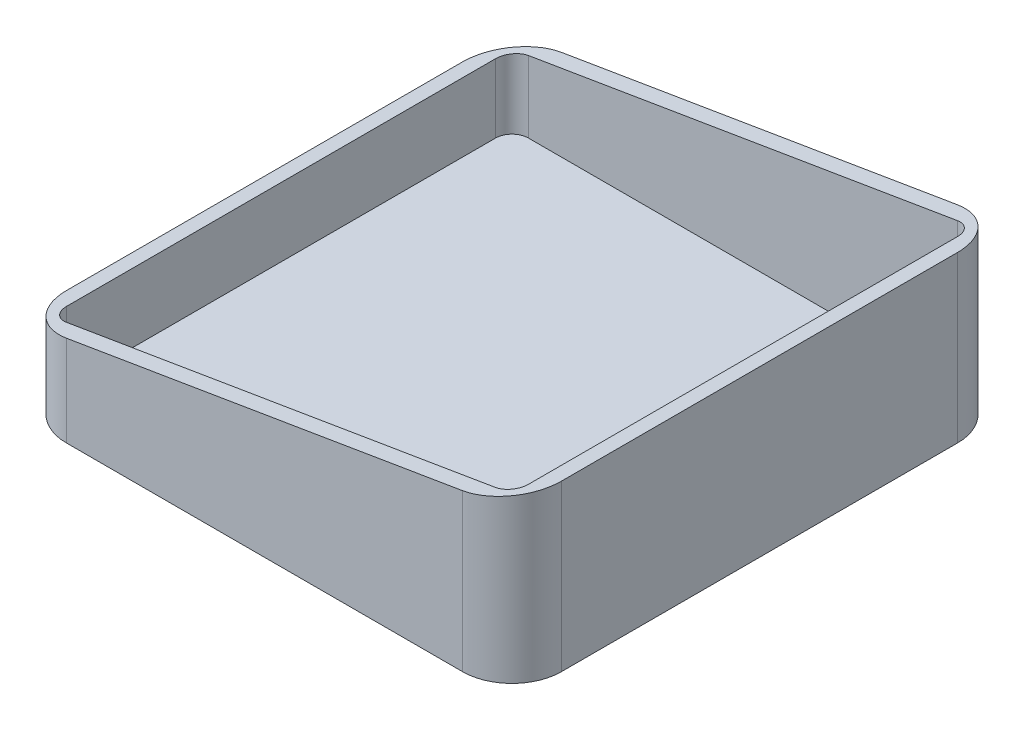
ISO-10303-21;
HEADER;
FILE_DESCRIPTION(('STEP AP214'),'2;1');
FILE_NAME('part.step','',(''),(''),'','','');
FILE_SCHEMA(('AUTOMOTIVE_DESIGN { 1 0 10303 214 1 1 1 1 }'));
ENDSEC;
DATA;
#1=APPLICATION_CONTEXT('core data for automotive mechanical design processes');
#2=APPLICATION_PROTOCOL_DEFINITION('international standard','automotive_design',2000,#1);
#3=PRODUCT_CONTEXT('',#1,'mechanical');
#4=PRODUCT('Part','Part','',(#3));
#5=PRODUCT_RELATED_PRODUCT_CATEGORY('part','',(#4));
#6=PRODUCT_DEFINITION_FORMATION('','',#4);
#7=PRODUCT_DEFINITION_CONTEXT('part definition',#1,'design');
#8=PRODUCT_DEFINITION('design','',#6,#7);
#9=PRODUCT_DEFINITION_SHAPE('','',#8);
#10=(LENGTH_UNIT() NAMED_UNIT(*) SI_UNIT(.MILLI.,.METRE.));
#11=(NAMED_UNIT(*) PLANE_ANGLE_UNIT() SI_UNIT($,.RADIAN.));
#12=(NAMED_UNIT(*) SI_UNIT($,.STERADIAN.) SOLID_ANGLE_UNIT());
#13=UNCERTAINTY_MEASURE_WITH_UNIT(LENGTH_MEASURE(1.E-05),#10,'distance_accuracy_value','');
#14=(GEOMETRIC_REPRESENTATION_CONTEXT(3) GLOBAL_UNCERTAINTY_ASSIGNED_CONTEXT((#13)) GLOBAL_UNIT_ASSIGNED_CONTEXT((#10,
#11,#12)) REPRESENTATION_CONTEXT('',''));
#15=CARTESIAN_POINT('',(0.,0.,0.));
#16=DIRECTION('',(0.,0.,1.));
#17=DIRECTION('',(1.,0.,0.));
#18=AXIS2_PLACEMENT_3D('',#15,#16,#17);
#19=CARTESIAN_POINT('',(150.,83.3783783783784,300.));
#20=DIRECTION('',(0.164398987305357,-0.986393923832144,0.));
#21=DIRECTION('',(0.986393923832144,0.164398987305357,0.));
#22=AXIS2_PLACEMENT_3D('',#19,#20,#21);
#23=PLANE('',#22);
#24=DIRECTION('',(-0.986393923832144,-0.164398987305357,0.));
#25=VECTOR('',#24,1.);
#26=CARTESIAN_POINT('',(150.,83.3783783783784,0.));
#27=LINE('',#26,#25);
#28=CARTESIAN_POINT('',(120.,78.3783783783784,0.));
#29=VERTEX_POINT('',#28);
#30=CARTESIAN_POINT('',(-120.,38.3783783783784,0.));
#31=VERTEX_POINT('',#30);
#32=EDGE_CURVE('E278',#29,#31,#27,.T.);
#33=ORIENTED_EDGE('',*,*,#32,.T.);
#34=CARTESIAN_POINT('',(-120.,38.3783783783784,30.));
#35=DIRECTION('',(0.164398987305357,-0.986393923832144,0.));
#36=DIRECTION('',(-0.986393923832144,-0.164398987305357,0.));
#37=AXIS2_PLACEMENT_3D('',#34,#35,#36);
#38=ELLIPSE('',#37,30.4138126514911,30.);
#39=CARTESIAN_POINT('',(-150.,33.3783783783784,30.));
#40=VERTEX_POINT('',#39);
#41=EDGE_CURVE('E194',#31,#40,#38,.F.);
#42=ORIENTED_EDGE('',*,*,#41,.T.);
#43=DIRECTION('',(0.,0.,-1.));
#44=VECTOR('',#43,1.);
#45=CARTESIAN_POINT('',(-150.,33.3783783783784,300.));
#46=LINE('',#45,#44);
#47=CARTESIAN_POINT('',(-150.,33.3783783783784,270.));
#48=VERTEX_POINT('',#47);
#49=EDGE_CURVE('E281',#48,#40,#46,.T.);
#50=ORIENTED_EDGE('',*,*,#49,.F.);
#51=CARTESIAN_POINT('',(-120.,38.3783783783784,270.));
#52=DIRECTION('',(0.164398987305357,-0.986393923832144,0.));
#53=DIRECTION('',(0.986393923832144,0.164398987305357,0.));
#54=AXIS2_PLACEMENT_3D('',#51,#52,#53);
#55=ELLIPSE('',#54,30.4138126514911,30.);
#56=CARTESIAN_POINT('',(-120.,38.3783783783784,300.));
#57=VERTEX_POINT('',#56);
#58=EDGE_CURVE('E175',#48,#57,#55,.F.);
#59=ORIENTED_EDGE('',*,*,#58,.T.);
#60=DIRECTION('',(-0.986393923832144,-0.164398987305357,0.));
#61=VECTOR('',#60,1.);
#62=CARTESIAN_POINT('',(150.,83.3783783783784,300.));
#63=LINE('',#62,#61);
#64=CARTESIAN_POINT('',(120.,78.3783783783784,300.));
#65=VERTEX_POINT('',#64);
#66=EDGE_CURVE('E277',#65,#57,#63,.T.);
#67=ORIENTED_EDGE('',*,*,#66,.F.);
#68=CARTESIAN_POINT('',(120.,78.3783783783784,270.));
#69=DIRECTION('',(0.164398987305357,-0.986393923832144,0.));
#70=DIRECTION('',(-0.986393923832144,-0.164398987305357,0.));
#71=AXIS2_PLACEMENT_3D('',#68,#69,#70);
#72=ELLIPSE('',#71,30.4138126514911,30.);
#73=CARTESIAN_POINT('',(150.,83.3783783783784,270.));
#74=VERTEX_POINT('',#73);
#75=EDGE_CURVE('E190',#65,#74,#72,.F.);
#76=ORIENTED_EDGE('',*,*,#75,.T.);
#77=DIRECTION('',(0.,0.,-1.));
#78=VECTOR('',#77,1.);
#79=CARTESIAN_POINT('',(150.,83.3783783783784,300.));
#80=LINE('',#79,#78);
#81=CARTESIAN_POINT('',(150.,83.3783783783784,30.));
#82=VERTEX_POINT('',#81);
#83=EDGE_CURVE('E287',#74,#82,#80,.T.);
#84=ORIENTED_EDGE('',*,*,#83,.T.);
#85=CARTESIAN_POINT('',(120.,78.3783783783784,30.));
#86=DIRECTION('',(0.164398987305357,-0.986393923832144,0.));
#87=DIRECTION('',(0.986393923832144,0.164398987305357,0.));
#88=AXIS2_PLACEMENT_3D('',#85,#86,#87);
#89=ELLIPSE('',#88,30.4138126514911,30.);
#90=EDGE_CURVE('E192',#82,#29,#89,.F.);
#91=ORIENTED_EDGE('',*,*,#90,.T.);
#92=EDGE_LOOP('',(#33,#42,#50,#59,#67,#76,#84,#91));
#93=FACE_BOUND('',#92,.T.);
#94=DIRECTION('',(-0.986393923832144,-0.164398987305357,0.));
#95=VECTOR('',#94,1.);
#96=CARTESIAN_POINT('',(150.,83.3783783783784,10.));
#97=LINE('',#96,#95);
#98=CARTESIAN_POINT('',(130.,80.045045045045,10.));
#99=VERTEX_POINT('',#98);
#100=CARTESIAN_POINT('',(-130.,36.7117117117117,10.));
#101=VERTEX_POINT('',#100);
#102=EDGE_CURVE('E271',#99,#101,#97,.T.);
#103=ORIENTED_EDGE('',*,*,#102,.F.);
#104=CARTESIAN_POINT('',(130.,80.045045045045,20.));
#105=DIRECTION('',(0.164398987305357,-0.986393923832144,0.));
#106=DIRECTION('',(-0.986393923832144,-0.164398987305357,0.));
#107=AXIS2_PLACEMENT_3D('',#104,#105,#106);
#108=ELLIPSE('',#107,10.137937550497,10.);
#109=CARTESIAN_POINT('',(140.,81.7117117117117,20.));
#110=VERTEX_POINT('',#109);
#111=EDGE_CURVE('E11',#99,#110,#108,.T.);
#112=ORIENTED_EDGE('',*,*,#111,.T.);
#113=DIRECTION('',(0.,0.,-1.));
#114=VECTOR('',#113,1.);
#115=CARTESIAN_POINT('',(140.,81.7117117117117,300.));
#116=LINE('',#115,#114);
#117=CARTESIAN_POINT('',(140.,81.7117117117117,280.));
#118=VERTEX_POINT('',#117);
#119=EDGE_CURVE('E240',#118,#110,#116,.T.);
#120=ORIENTED_EDGE('',*,*,#119,.F.);
#121=CARTESIAN_POINT('',(130.,80.045045045045,280.));
#122=DIRECTION('',(0.164398987305357,-0.986393923832144,0.));
#123=DIRECTION('',(0.986393923832144,0.164398987305357,0.));
#124=AXIS2_PLACEMENT_3D('',#121,#122,#123);
#125=ELLIPSE('',#124,10.137937550497,10.);
#126=CARTESIAN_POINT('',(130.,80.045045045045,290.));
#127=VERTEX_POINT('',#126);
#128=EDGE_CURVE('E47',#118,#127,#125,.T.);
#129=ORIENTED_EDGE('',*,*,#128,.T.);
#130=DIRECTION('',(-0.986393923832144,-0.164398987305357,0.));
#131=VECTOR('',#130,1.);
#132=CARTESIAN_POINT('',(150.,83.3783783783784,290.));
#133=LINE('',#132,#131);
#134=CARTESIAN_POINT('',(-130.,36.7117117117117,290.));
#135=VERTEX_POINT('',#134);
#136=EDGE_CURVE('E238',#127,#135,#133,.T.);
#137=ORIENTED_EDGE('',*,*,#136,.T.);
#138=CARTESIAN_POINT('',(-130.,36.7117117117117,280.));
#139=DIRECTION('',(0.164398987305357,-0.986393923832144,0.));
#140=DIRECTION('',(-0.986393923832144,-0.164398987305357,0.));
#141=AXIS2_PLACEMENT_3D('',#138,#139,#140);
#142=ELLIPSE('',#141,10.137937550497,10.);
#143=CARTESIAN_POINT('',(-140.,35.045045045045,280.));
#144=VERTEX_POINT('',#143);
#145=EDGE_CURVE('E235',#135,#144,#142,.T.);
#146=ORIENTED_EDGE('',*,*,#145,.T.);
#147=DIRECTION('',(0.,0.,-1.));
#148=VECTOR('',#147,1.);
#149=CARTESIAN_POINT('',(-140.,35.045045045045,300.));
#150=LINE('',#149,#148);
#151=CARTESIAN_POINT('',(-140.,35.045045045045,20.));
#152=VERTEX_POINT('',#151);
#153=EDGE_CURVE('E246',#144,#152,#150,.T.);
#154=ORIENTED_EDGE('',*,*,#153,.T.);
#155=CARTESIAN_POINT('',(-130.,36.7117117117117,20.));
#156=DIRECTION('',(0.164398987305357,-0.986393923832144,0.));
#157=DIRECTION('',(0.986393923832144,0.164398987305357,0.));
#158=AXIS2_PLACEMENT_3D('',#155,#156,#157);
#159=ELLIPSE('',#158,10.137937550497,10.);
#160=EDGE_CURVE('E233',#152,#101,#159,.T.);
#161=ORIENTED_EDGE('',*,*,#160,.T.);
#162=EDGE_LOOP('',(#103,#112,#120,#129,#137,#146,#154,#161));
#163=FACE_BOUND('',#162,.T.);
#164=ADVANCED_FACE('F39',(#93,#163),#23,.F.);
#165=CARTESIAN_POINT('',(-150.,33.3783783783784,300.));
#166=DIRECTION('',(1.,0.,0.));
#167=DIRECTION('',(0.,1.,0.));
#168=AXIS2_PLACEMENT_3D('',#165,#166,#167);
#169=PLANE('',#168);
#170=ORIENTED_EDGE('',*,*,#49,.T.);
#171=DIRECTION('',(0.,-1.,0.));
#172=VECTOR('',#171,1.);
#173=CARTESIAN_POINT('',(-150.,33.3783783783784,30.));
#174=LINE('',#173,#172);
#175=CARTESIAN_POINT('',(-150.,-16.6216216216216,30.));
#176=VERTEX_POINT('',#175);
#177=EDGE_CURVE('E162',#40,#176,#174,.T.);
#178=ORIENTED_EDGE('',*,*,#177,.T.);
#179=DIRECTION('',(0.,0.,-1.));
#180=VECTOR('',#179,1.);
#181=CARTESIAN_POINT('',(-150.,-16.6216216216216,300.));
#182=LINE('',#181,#180);
#183=CARTESIAN_POINT('',(-150.,-16.6216216216216,270.));
#184=VERTEX_POINT('',#183);
#185=EDGE_CURVE('E154',#184,#176,#182,.T.);
#186=ORIENTED_EDGE('',*,*,#185,.F.);
#187=DIRECTION('',(0.,-1.,0.));
#188=VECTOR('',#187,1.);
#189=CARTESIAN_POINT('',(-150.,33.3783783783784,270.));
#190=LINE('',#189,#188);
#191=EDGE_CURVE('E168',#184,#48,#190,.F.);
#192=ORIENTED_EDGE('',*,*,#191,.T.);
#193=EDGE_LOOP('',(#170,#178,#186,#192));
#194=FACE_BOUND('',#193,.T.);
#195=ADVANCED_FACE('F167',(#194),#169,.F.);
#196=CARTESIAN_POINT('',(-150.,-16.6216216216216,300.));
#197=DIRECTION('',(0.,1.,0.));
#198=DIRECTION('',(0.,0.,1.));
#199=AXIS2_PLACEMENT_3D('',#196,#197,#198);
#200=PLANE('',#199);
#201=ORIENTED_EDGE('',*,*,#185,.T.);
#202=CARTESIAN_POINT('',(-120.,-16.6216216216216,30.));
#203=DIRECTION('',(0.,1.,0.));
#204=DIRECTION('',(0.,0.,1.));
#205=AXIS2_PLACEMENT_3D('',#202,#203,#204);
#206=CIRCLE('',#205,30.);
#207=CARTESIAN_POINT('',(-120.,-16.6216216216216,0.));
#208=VERTEX_POINT('',#207);
#209=EDGE_CURVE('E183',#176,#208,#206,.F.);
#210=ORIENTED_EDGE('',*,*,#209,.T.);
#211=DIRECTION('',(1.,0.,0.));
#212=VECTOR('',#211,1.);
#213=CARTESIAN_POINT('',(-150.,-16.6216216216216,0.));
#214=LINE('',#213,#212);
#215=CARTESIAN_POINT('',(120.,-16.6216216216216,0.));
#216=VERTEX_POINT('',#215);
#217=EDGE_CURVE('E264',#208,#216,#214,.T.);
#218=ORIENTED_EDGE('',*,*,#217,.T.);
#219=CARTESIAN_POINT('',(120.,-16.6216216216216,30.));
#220=DIRECTION('',(0.,1.,0.));
#221=DIRECTION('',(0.,0.,1.));
#222=AXIS2_PLACEMENT_3D('',#219,#220,#221);
#223=CIRCLE('',#222,30.);
#224=CARTESIAN_POINT('',(150.,-16.6216216216216,30.));
#225=VERTEX_POINT('',#224);
#226=EDGE_CURVE('E181',#216,#225,#223,.F.);
#227=ORIENTED_EDGE('',*,*,#226,.T.);
#228=DIRECTION('',(0.,0.,-1.));
#229=VECTOR('',#228,1.);
#230=CARTESIAN_POINT('',(150.,-16.6216216216216,300.));
#231=LINE('',#230,#229);
#232=CARTESIAN_POINT('',(150.,-16.6216216216216,270.));
#233=VERTEX_POINT('',#232);
#234=EDGE_CURVE('E171',#233,#225,#231,.T.);
#235=ORIENTED_EDGE('',*,*,#234,.F.);
#236=CARTESIAN_POINT('',(120.,-16.6216216216216,270.));
#237=DIRECTION('',(0.,1.,0.));
#238=DIRECTION('',(0.,0.,1.));
#239=AXIS2_PLACEMENT_3D('',#236,#237,#238);
#240=CIRCLE('',#239,30.);
#241=CARTESIAN_POINT('',(120.,-16.6216216216216,300.));
#242=VERTEX_POINT('',#241);
#243=EDGE_CURVE('E161',#233,#242,#240,.F.);
#244=ORIENTED_EDGE('',*,*,#243,.T.);
#245=DIRECTION('',(1.,0.,0.));
#246=VECTOR('',#245,1.);
#247=CARTESIAN_POINT('',(-150.,-16.6216216216216,300.));
#248=LINE('',#247,#246);
#249=CARTESIAN_POINT('',(-120.,-16.6216216216216,300.));
#250=VERTEX_POINT('',#249);
#251=EDGE_CURVE('E156',#250,#242,#248,.T.);
#252=ORIENTED_EDGE('',*,*,#251,.F.);
#253=CARTESIAN_POINT('',(-120.,-16.6216216216216,270.));
#254=DIRECTION('',(0.,1.,0.));
#255=DIRECTION('',(0.,0.,1.));
#256=AXIS2_PLACEMENT_3D('',#253,#254,#255);
#257=CIRCLE('',#256,30.);
#258=EDGE_CURVE('E151',#250,#184,#257,.F.);
#259=ORIENTED_EDGE('',*,*,#258,.T.);
#260=EDGE_LOOP('',(#201,#210,#218,#227,#235,#244,#252,#259));
#261=FACE_BOUND('',#260,.T.);
#262=ADVANCED_FACE('F153',(#261),#200,.F.);
#263=CARTESIAN_POINT('',(150.,-16.6216216216216,300.));
#264=DIRECTION('',(-1.,0.,0.));
#265=DIRECTION('',(0.,-1.,0.));
#266=AXIS2_PLACEMENT_3D('',#263,#264,#265);
#267=PLANE('',#266);
#268=ORIENTED_EDGE('',*,*,#234,.T.);
#269=DIRECTION('',(0.,1.,0.));
#270=VECTOR('',#269,1.);
#271=CARTESIAN_POINT('',(150.,-16.6216216216216,30.));
#272=LINE('',#271,#270);
#273=EDGE_CURVE('E198',#225,#82,#272,.T.);
#274=ORIENTED_EDGE('',*,*,#273,.T.);
#275=ORIENTED_EDGE('',*,*,#83,.F.);
#276=DIRECTION('',(0.,1.,0.));
#277=VECTOR('',#276,1.);
#278=CARTESIAN_POINT('',(150.,-16.6216216216216,270.));
#279=LINE('',#278,#277);
#280=EDGE_CURVE('E196',#74,#233,#279,.F.);
#281=ORIENTED_EDGE('',*,*,#280,.T.);
#282=EDGE_LOOP('',(#268,#274,#275,#281));
#283=FACE_BOUND('',#282,.T.);
#284=ADVANCED_FACE('F293',(#283),#267,.F.);
#285=CARTESIAN_POINT('',(0.,0.,300.));
#286=DIRECTION('',(0.,0.,1.));
#287=DIRECTION('',(1.,0.,0.));
#288=AXIS2_PLACEMENT_3D('',#285,#286,#287);
#289=PLANE('',#288);
#290=ORIENTED_EDGE('',*,*,#251,.T.);
#291=DIRECTION('',(0.,1.,0.));
#292=VECTOR('',#291,1.);
#293=CARTESIAN_POINT('',(120.,83.3783783783784,300.));
#294=LINE('',#293,#292);
#295=EDGE_CURVE('E203',#242,#65,#294,.T.);
#296=ORIENTED_EDGE('',*,*,#295,.T.);
#297=ORIENTED_EDGE('',*,*,#66,.T.);
#298=DIRECTION('',(0.,-1.,0.));
#299=VECTOR('',#298,1.);
#300=CARTESIAN_POINT('',(-120.,-16.6216216216217,300.));
#301=LINE('',#300,#299);
#302=EDGE_CURVE('E201',#57,#250,#301,.T.);
#303=ORIENTED_EDGE('',*,*,#302,.T.);
#304=EDGE_LOOP('',(#290,#296,#297,#303));
#305=FACE_BOUND('',#304,.T.);
#306=ADVANCED_FACE('F312',(#305),#289,.T.);
#307=CARTESIAN_POINT('',(0.,0.,0.));
#308=DIRECTION('',(0.,0.,1.));
#309=DIRECTION('',(1.,0.,0.));
#310=AXIS2_PLACEMENT_3D('',#307,#308,#309);
#311=PLANE('',#310);
#312=ORIENTED_EDGE('',*,*,#217,.F.);
#313=DIRECTION('',(0.,-1.,0.));
#314=VECTOR('',#313,1.);
#315=CARTESIAN_POINT('',(-120.,3.99680288865056E-13,0.));
#316=LINE('',#315,#314);
#317=EDGE_CURVE('E187',#208,#31,#316,.F.);
#318=ORIENTED_EDGE('',*,*,#317,.T.);
#319=ORIENTED_EDGE('',*,*,#32,.F.);
#320=DIRECTION('',(0.,1.,0.));
#321=VECTOR('',#320,1.);
#322=CARTESIAN_POINT('',(120.,0.,0.));
#323=LINE('',#322,#321);
#324=EDGE_CURVE('E185',#29,#216,#323,.F.);
#325=ORIENTED_EDGE('',*,*,#324,.T.);
#326=EDGE_LOOP('',(#312,#318,#319,#325));
#327=FACE_BOUND('',#326,.T.);
#328=ADVANCED_FACE('F306',(#327),#311,.F.);
#329=CARTESIAN_POINT('',(-140.,33.3783783783783,300.));
#330=DIRECTION('',(1.,0.,0.));
#331=DIRECTION('',(0.,1.,0.));
#332=AXIS2_PLACEMENT_3D('',#329,#330,#331);
#333=PLANE('',#332);
#334=DIRECTION('',(0.,0.,-1.));
#335=VECTOR('',#334,1.);
#336=CARTESIAN_POINT('',(-140.,-6.62162162162163,300.));
#337=LINE('',#336,#335);
#338=CARTESIAN_POINT('',(-140.,-6.62162162162163,280.));
#339=VERTEX_POINT('',#338);
#340=CARTESIAN_POINT('',(-140.,-6.62162162162163,20.));
#341=VERTEX_POINT('',#340);
#342=EDGE_CURVE('E261',#339,#341,#337,.T.);
#343=ORIENTED_EDGE('',*,*,#342,.T.);
#344=DIRECTION('',(0.,-1.,0.));
#345=VECTOR('',#344,1.);
#346=CARTESIAN_POINT('',(-140.,35.045045045045,20.));
#347=LINE('',#346,#345);
#348=EDGE_CURVE('E223',#341,#152,#347,.F.);
#349=ORIENTED_EDGE('',*,*,#348,.T.);
#350=ORIENTED_EDGE('',*,*,#153,.F.);
#351=DIRECTION('',(0.,-1.,0.));
#352=VECTOR('',#351,1.);
#353=CARTESIAN_POINT('',(-140.,33.3783783783783,280.));
#354=LINE('',#353,#352);
#355=EDGE_CURVE('E220',#144,#339,#354,.T.);
#356=ORIENTED_EDGE('',*,*,#355,.T.);
#357=EDGE_LOOP('',(#343,#349,#350,#356));
#358=FACE_BOUND('',#357,.T.);
#359=ADVANCED_FACE('F356',(#358),#333,.T.);
#360=CARTESIAN_POINT('',(-150.,-6.62162162162163,300.));
#361=DIRECTION('',(0.,1.,0.));
#362=DIRECTION('',(0.,0.,1.));
#363=AXIS2_PLACEMENT_3D('',#360,#361,#362);
#364=PLANE('',#363);
#365=DIRECTION('',(1.,0.,0.));
#366=VECTOR('',#365,1.);
#367=CARTESIAN_POINT('',(-150.,-6.62162162162163,10.));
#368=LINE('',#367,#366);
#369=CARTESIAN_POINT('',(-130.,-6.62162162162163,10.));
#370=VERTEX_POINT('',#369);
#371=CARTESIAN_POINT('',(130.,-6.62162162162163,10.));
#372=VERTEX_POINT('',#371);
#373=EDGE_CURVE('E269',#370,#372,#368,.T.);
#374=ORIENTED_EDGE('',*,*,#373,.F.);
#375=CARTESIAN_POINT('',(-130.,-6.62162162162163,20.));
#376=DIRECTION('',(0.,1.,0.));
#377=DIRECTION('',(0.,0.,1.));
#378=AXIS2_PLACEMENT_3D('',#375,#376,#377);
#379=CIRCLE('',#378,10.);
#380=EDGE_CURVE('E218',#370,#341,#379,.T.);
#381=ORIENTED_EDGE('',*,*,#380,.T.);
#382=ORIENTED_EDGE('',*,*,#342,.F.);
#383=CARTESIAN_POINT('',(-130.,-6.62162162162163,280.));
#384=DIRECTION('',(0.,1.,0.));
#385=DIRECTION('',(0.,0.,1.));
#386=AXIS2_PLACEMENT_3D('',#383,#384,#385);
#387=CIRCLE('',#386,10.);
#388=CARTESIAN_POINT('',(-130.,-6.62162162162163,290.));
#389=VERTEX_POINT('',#388);
#390=EDGE_CURVE('E216',#339,#389,#387,.T.);
#391=ORIENTED_EDGE('',*,*,#390,.T.);
#392=DIRECTION('',(1.,0.,0.));
#393=VECTOR('',#392,1.);
#394=CARTESIAN_POINT('',(-150.,-6.62162162162163,290.));
#395=LINE('',#394,#393);
#396=CARTESIAN_POINT('',(130.,-6.62162162162163,290.));
#397=VERTEX_POINT('',#396);
#398=EDGE_CURVE('E247',#389,#397,#395,.T.);
#399=ORIENTED_EDGE('',*,*,#398,.T.);
#400=CARTESIAN_POINT('',(130.,-6.62162162162163,280.));
#401=DIRECTION('',(0.,1.,0.));
#402=DIRECTION('',(0.,0.,1.));
#403=AXIS2_PLACEMENT_3D('',#400,#401,#402);
#404=CIRCLE('',#403,10.);
#405=CARTESIAN_POINT('',(140.,-6.62162162162163,280.));
#406=VERTEX_POINT('',#405);
#407=EDGE_CURVE('E214',#397,#406,#404,.T.);
#408=ORIENTED_EDGE('',*,*,#407,.T.);
#409=DIRECTION('',(0.,0.,-1.));
#410=VECTOR('',#409,1.);
#411=CARTESIAN_POINT('',(140.,-6.62162162162163,300.));
#412=LINE('',#411,#410);
#413=CARTESIAN_POINT('',(140.,-6.62162162162163,20.));
#414=VERTEX_POINT('',#413);
#415=EDGE_CURVE('E256',#406,#414,#412,.T.);
#416=ORIENTED_EDGE('',*,*,#415,.T.);
#417=CARTESIAN_POINT('',(130.,-6.62162162162163,20.));
#418=DIRECTION('',(0.,1.,0.));
#419=DIRECTION('',(0.,0.,1.));
#420=AXIS2_PLACEMENT_3D('',#417,#418,#419);
#421=CIRCLE('',#420,10.);
#422=EDGE_CURVE('E212',#414,#372,#421,.T.);
#423=ORIENTED_EDGE('',*,*,#422,.T.);
#424=EDGE_LOOP('',(#374,#381,#382,#391,#399,#408,#416,#423));
#425=FACE_BOUND('',#424,.T.);
#426=ADVANCED_FACE('F255',(#425),#364,.T.);
#427=CARTESIAN_POINT('',(140.,-16.6216216216216,300.));
#428=DIRECTION('',(-1.,0.,0.));
#429=DIRECTION('',(0.,-1.,0.));
#430=AXIS2_PLACEMENT_3D('',#427,#428,#429);
#431=PLANE('',#430);
#432=ORIENTED_EDGE('',*,*,#415,.F.);
#433=DIRECTION('',(0.,1.,0.));
#434=VECTOR('',#433,1.);
#435=CARTESIAN_POINT('',(140.,-16.6216216216216,280.));
#436=LINE('',#435,#434);
#437=EDGE_CURVE('E231',#406,#118,#436,.T.);
#438=ORIENTED_EDGE('',*,*,#437,.T.);
#439=ORIENTED_EDGE('',*,*,#119,.T.);
#440=DIRECTION('',(0.,1.,0.));
#441=VECTOR('',#440,1.);
#442=CARTESIAN_POINT('',(140.,-6.62162162162163,20.));
#443=LINE('',#442,#441);
#444=EDGE_CURVE('E229',#110,#414,#443,.F.);
#445=ORIENTED_EDGE('',*,*,#444,.T.);
#446=EDGE_LOOP('',(#432,#438,#439,#445));
#447=FACE_BOUND('',#446,.T.);
#448=ADVANCED_FACE('F259',(#447),#431,.T.);
#449=CARTESIAN_POINT('',(0.,0.,290.));
#450=DIRECTION('',(0.,0.,1.));
#451=DIRECTION('',(1.,0.,0.));
#452=AXIS2_PLACEMENT_3D('',#449,#450,#451);
#453=PLANE('',#452);
#454=ORIENTED_EDGE('',*,*,#398,.F.);
#455=DIRECTION('',(0.,-1.,0.));
#456=VECTOR('',#455,1.);
#457=CARTESIAN_POINT('',(-130.,4.3298697960381E-13,290.));
#458=LINE('',#457,#456);
#459=EDGE_CURVE('E227',#389,#135,#458,.F.);
#460=ORIENTED_EDGE('',*,*,#459,.T.);
#461=ORIENTED_EDGE('',*,*,#136,.F.);
#462=DIRECTION('',(0.,1.,0.));
#463=VECTOR('',#462,1.);
#464=CARTESIAN_POINT('',(130.,0.,290.));
#465=LINE('',#464,#463);
#466=EDGE_CURVE('E225',#127,#397,#465,.F.);
#467=ORIENTED_EDGE('',*,*,#466,.T.);
#468=EDGE_LOOP('',(#454,#460,#461,#467));
#469=FACE_BOUND('',#468,.T.);
#470=ADVANCED_FACE('F243',(#469),#453,.F.);
#471=CARTESIAN_POINT('',(0.,0.,10.));
#472=DIRECTION('',(0.,0.,1.));
#473=DIRECTION('',(1.,0.,0.));
#474=AXIS2_PLACEMENT_3D('',#471,#472,#473);
#475=PLANE('',#474);
#476=ORIENTED_EDGE('',*,*,#102,.T.);
#477=DIRECTION('',(0.,-1.,0.));
#478=VECTOR('',#477,1.);
#479=CARTESIAN_POINT('',(-130.,-6.62162162162167,10.));
#480=LINE('',#479,#478);
#481=EDGE_CURVE('E209',#101,#370,#480,.T.);
#482=ORIENTED_EDGE('',*,*,#481,.T.);
#483=ORIENTED_EDGE('',*,*,#373,.T.);
#484=DIRECTION('',(0.,1.,0.));
#485=VECTOR('',#484,1.);
#486=CARTESIAN_POINT('',(130.,81.7117117117117,10.));
#487=LINE('',#486,#485);
#488=EDGE_CURVE('E206',#372,#99,#487,.T.);
#489=ORIENTED_EDGE('',*,*,#488,.T.);
#490=EDGE_LOOP('',(#476,#482,#483,#489));
#491=FACE_BOUND('',#490,.T.);
#492=ADVANCED_FACE('F340',(#491),#475,.T.);
#493=CARTESIAN_POINT('',(-120.,33.3783783783783,30.));
#494=DIRECTION('',(0.,-1.,0.));
#495=DIRECTION('',(1.,0.,0.));
#496=AXIS2_PLACEMENT_3D('',#493,#494,#495);
#497=CYLINDRICAL_SURFACE('',#496,30.);
#498=ORIENTED_EDGE('',*,*,#41,.F.);
#499=ORIENTED_EDGE('',*,*,#317,.F.);
#500=ORIENTED_EDGE('',*,*,#209,.F.);
#501=ORIENTED_EDGE('',*,*,#177,.F.);
#502=EDGE_LOOP('',(#498,#499,#500,#501));
#503=FACE_BOUND('',#502,.T.);
#504=ADVANCED_FACE('F309',(#503),#497,.T.);
#505=CARTESIAN_POINT('',(120.,-16.6216216216216,30.));
#506=DIRECTION('',(0.,1.,0.));
#507=DIRECTION('',(-1.,0.,0.));
#508=AXIS2_PLACEMENT_3D('',#505,#506,#507);
#509=CYLINDRICAL_SURFACE('',#508,30.);
#510=ORIENTED_EDGE('',*,*,#226,.F.);
#511=ORIENTED_EDGE('',*,*,#324,.F.);
#512=ORIENTED_EDGE('',*,*,#90,.F.);
#513=ORIENTED_EDGE('',*,*,#273,.F.);
#514=EDGE_LOOP('',(#510,#511,#512,#513));
#515=FACE_BOUND('',#514,.T.);
#516=ADVANCED_FACE('F299',(#515),#509,.T.);
#517=CARTESIAN_POINT('',(120.,0.,270.));
#518=DIRECTION('',(0.,-1.,0.));
#519=DIRECTION('',(1.,0.,0.));
#520=AXIS2_PLACEMENT_3D('',#517,#518,#519);
#521=CYLINDRICAL_SURFACE('',#520,30.);
#522=ORIENTED_EDGE('',*,*,#243,.F.);
#523=ORIENTED_EDGE('',*,*,#280,.F.);
#524=ORIENTED_EDGE('',*,*,#75,.F.);
#525=ORIENTED_EDGE('',*,*,#295,.F.);
#526=EDGE_LOOP('',(#522,#523,#524,#525));
#527=FACE_BOUND('',#526,.T.);
#528=ADVANCED_FACE('F315',(#527),#521,.T.);
#529=CARTESIAN_POINT('',(-120.,3.99680288865056E-13,270.));
#530=DIRECTION('',(0.,1.,0.));
#531=DIRECTION('',(-1.,0.,0.));
#532=AXIS2_PLACEMENT_3D('',#529,#530,#531);
#533=CYLINDRICAL_SURFACE('',#532,30.);
#534=ORIENTED_EDGE('',*,*,#58,.F.);
#535=ORIENTED_EDGE('',*,*,#191,.F.);
#536=ORIENTED_EDGE('',*,*,#258,.F.);
#537=ORIENTED_EDGE('',*,*,#302,.F.);
#538=EDGE_LOOP('',(#534,#535,#536,#537));
#539=FACE_BOUND('',#538,.T.);
#540=ADVANCED_FACE('F174',(#539),#533,.T.);
#541=CARTESIAN_POINT('',(-130.,4.3298697960381E-13,20.));
#542=DIRECTION('',(0.,1.,0.));
#543=DIRECTION('',(-1.,0.,0.));
#544=AXIS2_PLACEMENT_3D('',#541,#542,#543);
#545=CYLINDRICAL_SURFACE('',#544,10.);
#546=ORIENTED_EDGE('',*,*,#160,.F.);
#547=ORIENTED_EDGE('',*,*,#348,.F.);
#548=ORIENTED_EDGE('',*,*,#380,.F.);
#549=ORIENTED_EDGE('',*,*,#481,.F.);
#550=EDGE_LOOP('',(#546,#547,#548,#549));
#551=FACE_BOUND('',#550,.T.);
#552=ADVANCED_FACE('F322',(#551),#545,.F.);
#553=CARTESIAN_POINT('',(-130.,33.3783783783783,280.));
#554=DIRECTION('',(0.,-1.,0.));
#555=DIRECTION('',(1.,0.,0.));
#556=AXIS2_PLACEMENT_3D('',#553,#554,#555);
#557=CYLINDRICAL_SURFACE('',#556,10.);
#558=ORIENTED_EDGE('',*,*,#145,.F.);
#559=ORIENTED_EDGE('',*,*,#459,.F.);
#560=ORIENTED_EDGE('',*,*,#390,.F.);
#561=ORIENTED_EDGE('',*,*,#355,.F.);
#562=EDGE_LOOP('',(#558,#559,#560,#561));
#563=FACE_BOUND('',#562,.T.);
#564=ADVANCED_FACE('F408',(#563),#557,.F.);
#565=CARTESIAN_POINT('',(130.,-16.6216216216216,280.));
#566=DIRECTION('',(0.,1.,0.));
#567=DIRECTION('',(-1.,0.,0.));
#568=AXIS2_PLACEMENT_3D('',#565,#566,#567);
#569=CYLINDRICAL_SURFACE('',#568,10.);
#570=ORIENTED_EDGE('',*,*,#407,.F.);
#571=ORIENTED_EDGE('',*,*,#466,.F.);
#572=ORIENTED_EDGE('',*,*,#128,.F.);
#573=ORIENTED_EDGE('',*,*,#437,.F.);
#574=EDGE_LOOP('',(#570,#571,#572,#573));
#575=FACE_BOUND('',#574,.T.);
#576=ADVANCED_FACE('F250',(#575),#569,.F.);
#577=CARTESIAN_POINT('',(130.,0.,20.));
#578=DIRECTION('',(0.,-1.,0.));
#579=DIRECTION('',(1.,0.,0.));
#580=AXIS2_PLACEMENT_3D('',#577,#578,#579);
#581=CYLINDRICAL_SURFACE('',#580,10.);
#582=ORIENTED_EDGE('',*,*,#422,.F.);
#583=ORIENTED_EDGE('',*,*,#444,.F.);
#584=ORIENTED_EDGE('',*,*,#111,.F.);
#585=ORIENTED_EDGE('',*,*,#488,.F.);
#586=EDGE_LOOP('',(#582,#583,#584,#585));
#587=FACE_BOUND('',#586,.T.);
#588=ADVANCED_FACE('F41',(#587),#581,.F.);
#589=CLOSED_SHELL('',(#164,#195,#262,#284,#306,#328,#359,#426,#448,#470,#492,#504,#516,#528,
#540,#552,#564,#576,#588));
#590=MANIFOLD_SOLID_BREP('B2',#589);
#591=ADVANCED_BREP_SHAPE_REPRESENTATION('',(#18,#590),#14);
#592=SHAPE_DEFINITION_REPRESENTATION(#9,#591);
ENDSEC;
END-ISO-10303-21;
